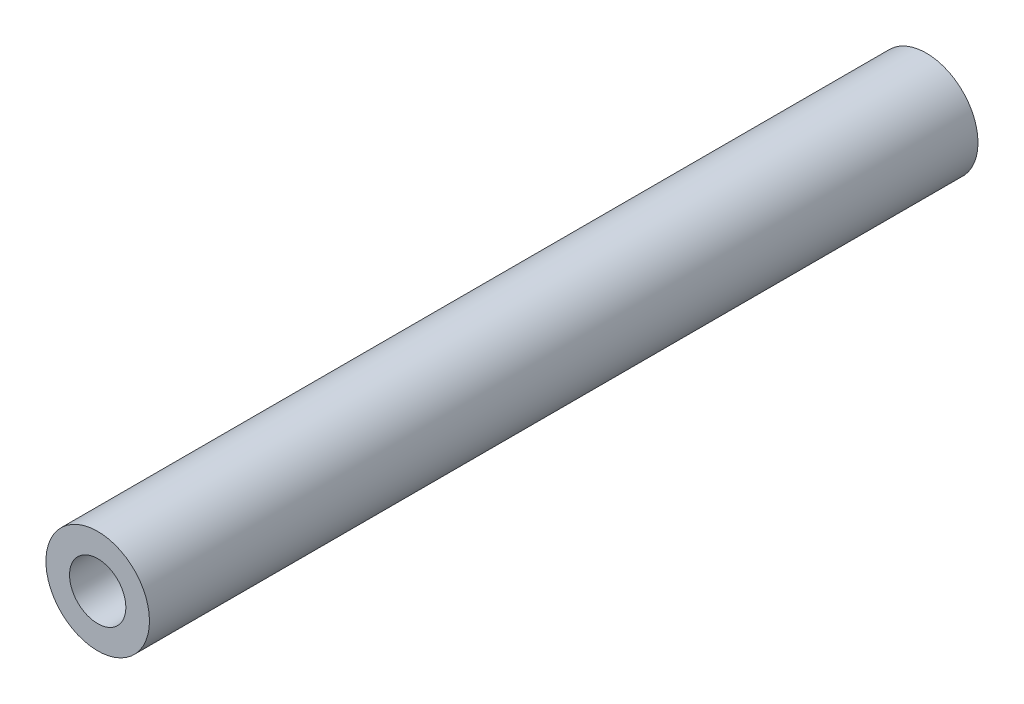
ISO-10303-21;
HEADER;
FILE_DESCRIPTION(('STEP AP214'),'2;1');
FILE_NAME('part.step','',(''),(''),'','','');
FILE_SCHEMA(('AUTOMOTIVE_DESIGN { 1 0 10303 214 1 1 1 1 }'));
ENDSEC;
DATA;
#1=APPLICATION_CONTEXT('core data for automotive mechanical design processes');
#2=APPLICATION_PROTOCOL_DEFINITION('international standard','automotive_design',2000,#1);
#3=PRODUCT_CONTEXT('',#1,'mechanical');
#4=PRODUCT('Part','Part','',(#3));
#5=PRODUCT_RELATED_PRODUCT_CATEGORY('part','',(#4));
#6=PRODUCT_DEFINITION_FORMATION('','',#4);
#7=PRODUCT_DEFINITION_CONTEXT('part definition',#1,'design');
#8=PRODUCT_DEFINITION('design','',#6,#7);
#9=PRODUCT_DEFINITION_SHAPE('','',#8);
#10=(LENGTH_UNIT() NAMED_UNIT(*) SI_UNIT(.MILLI.,.METRE.));
#11=(NAMED_UNIT(*) PLANE_ANGLE_UNIT() SI_UNIT($,.RADIAN.));
#12=(NAMED_UNIT(*) SI_UNIT($,.STERADIAN.) SOLID_ANGLE_UNIT());
#13=UNCERTAINTY_MEASURE_WITH_UNIT(LENGTH_MEASURE(1.E-05),#10,'distance_accuracy_value','');
#14=(GEOMETRIC_REPRESENTATION_CONTEXT(3) GLOBAL_UNCERTAINTY_ASSIGNED_CONTEXT((#13)) GLOBAL_UNIT_ASSIGNED_CONTEXT((#10,
#11,#12)) REPRESENTATION_CONTEXT('',''));
#15=CARTESIAN_POINT('',(0.,0.,0.));
#16=DIRECTION('',(0.,0.,1.));
#17=DIRECTION('',(1.,0.,0.));
#18=AXIS2_PLACEMENT_3D('',#15,#16,#17);
#19=CARTESIAN_POINT('',(0.,0.,25.4));
#20=DIRECTION('',(0.,0.,-1.));
#21=DIRECTION('',(-1.,0.,0.));
#22=AXIS2_PLACEMENT_3D('',#19,#20,#21);
#23=CYLINDRICAL_SURFACE('',#22,3.175);
#24=CARTESIAN_POINT('',(0.,0.,25.4));
#25=DIRECTION('',(0.,0.,1.));
#26=DIRECTION('',(1.,0.,0.));
#27=AXIS2_PLACEMENT_3D('',#24,#25,#26);
#28=CIRCLE('',#27,3.175);
#29=CARTESIAN_POINT('',(3.175,0.,25.4));
#30=VERTEX_POINT('',#29);
#31=EDGE_CURVE('E11',#30,#30,#28,.T.);
#32=ORIENTED_EDGE('',*,*,#31,.F.);
#33=EDGE_LOOP('',(#32));
#34=FACE_BOUND('',#33,.T.);
#35=CARTESIAN_POINT('',(0.,0.,-25.4));
#36=DIRECTION('',(0.,0.,1.));
#37=DIRECTION('',(1.,0.,0.));
#38=AXIS2_PLACEMENT_3D('',#35,#36,#37);
#39=CIRCLE('',#38,3.175);
#40=CARTESIAN_POINT('',(3.175,0.,-25.4));
#41=VERTEX_POINT('',#40);
#42=EDGE_CURVE('E38',#41,#41,#39,.T.);
#43=ORIENTED_EDGE('',*,*,#42,.T.);
#44=EDGE_LOOP('',(#43));
#45=FACE_BOUND('',#44,.T.);
#46=ADVANCED_FACE('F35',(#34,#45),#23,.T.);
#47=CARTESIAN_POINT('',(0.,0.,25.4));
#48=DIRECTION('',(0.,0.,1.));
#49=DIRECTION('',(1.,0.,0.));
#50=AXIS2_PLACEMENT_3D('',#47,#48,#49);
#51=PLANE('',#50);
#52=CARTESIAN_POINT('',(0.,0.,25.4));
#53=DIRECTION('',(0.,0.,1.));
#54=DIRECTION('',(1.,0.,0.));
#55=AXIS2_PLACEMENT_3D('',#52,#53,#54);
#56=CIRCLE('',#55,1.72719999999999);
#57=CARTESIAN_POINT('',(1.72719999999999,0.,25.4));
#58=VERTEX_POINT('',#57);
#59=EDGE_CURVE('E59',#58,#58,#56,.T.);
#60=ORIENTED_EDGE('',*,*,#59,.F.);
#61=EDGE_LOOP('',(#60));
#62=FACE_BOUND('',#61,.T.);
#63=ORIENTED_EDGE('',*,*,#31,.T.);
#64=EDGE_LOOP('',(#63));
#65=FACE_BOUND('',#64,.T.);
#66=ADVANCED_FACE('F77',(#62,#65),#51,.T.);
#67=CARTESIAN_POINT('',(0.,0.,-25.4));
#68=DIRECTION('',(0.,0.,1.));
#69=DIRECTION('',(1.,0.,0.));
#70=AXIS2_PLACEMENT_3D('',#67,#68,#69);
#71=PLANE('',#70);
#72=CARTESIAN_POINT('',(0.,0.,-25.4));
#73=DIRECTION('',(0.,0.,-1.));
#74=DIRECTION('',(-1.,0.,0.));
#75=AXIS2_PLACEMENT_3D('',#72,#73,#74);
#76=CIRCLE('',#75,1.72719999999999);
#77=CARTESIAN_POINT('',(-1.72719999999999,0.,-25.4));
#78=VERTEX_POINT('',#77);
#79=EDGE_CURVE('E58',#78,#78,#76,.T.);
#80=ORIENTED_EDGE('',*,*,#79,.F.);
#81=EDGE_LOOP('',(#80));
#82=FACE_BOUND('',#81,.T.);
#83=ORIENTED_EDGE('',*,*,#42,.F.);
#84=EDGE_LOOP('',(#83));
#85=FACE_BOUND('',#84,.T.);
#86=ADVANCED_FACE('F74',(#82,#85),#71,.F.);
#87=CARTESIAN_POINT('',(0.,0.,-19.05));
#88=DIRECTION('',(0.,0.,-1.));
#89=DIRECTION('',(-1.,0.,0.));
#90=AXIS2_PLACEMENT_3D('',#87,#88,#89);
#91=CONICAL_SURFACE('',#90,1.7272,1.02974425867666);
#92=CARTESIAN_POINT('',(0.,0.,-18.0121935388156));
#93=VERTEX_POINT('',#92);
#94=VERTEX_LOOP('',#93);
#95=FACE_BOUND('',#94,.T.);
#96=CARTESIAN_POINT('',(0.,0.,-19.05));
#97=DIRECTION('',(0.,0.,-1.));
#98=DIRECTION('',(-1.,0.,0.));
#99=AXIS2_PLACEMENT_3D('',#96,#97,#98);
#100=CIRCLE('',#99,1.7272);
#101=CARTESIAN_POINT('',(-1.7272,0.,-19.05));
#102=VERTEX_POINT('',#101);
#103=EDGE_CURVE('E62',#102,#102,#100,.T.);
#104=ORIENTED_EDGE('',*,*,#103,.T.);
#105=EDGE_LOOP('',(#104));
#106=FACE_BOUND('',#105,.T.);
#107=ADVANCED_FACE('F76',(#95,#106),#91,.F.);
#108=CARTESIAN_POINT('',(0.,0.,-25.4));
#109=DIRECTION('',(0.,0.,-1.));
#110=DIRECTION('',(-1.,0.,0.));
#111=AXIS2_PLACEMENT_3D('',#108,#109,#110);
#112=CYLINDRICAL_SURFACE('',#111,1.72719999999999);
#113=ORIENTED_EDGE('',*,*,#103,.F.);
#114=EDGE_LOOP('',(#113));
#115=FACE_BOUND('',#114,.T.);
#116=ORIENTED_EDGE('',*,*,#79,.T.);
#117=EDGE_LOOP('',(#116));
#118=FACE_BOUND('',#117,.T.);
#119=ADVANCED_FACE('F52',(#115,#118),#112,.F.);
#120=CARTESIAN_POINT('',(0.,0.,19.05));
#121=DIRECTION('',(0.,0.,1.));
#122=DIRECTION('',(1.,0.,0.));
#123=AXIS2_PLACEMENT_3D('',#120,#121,#122);
#124=CONICAL_SURFACE('',#123,1.7272,1.02974425867666);
#125=CARTESIAN_POINT('',(0.,0.,18.0121935388156));
#126=VERTEX_POINT('',#125);
#127=VERTEX_LOOP('',#126);
#128=FACE_BOUND('',#127,.T.);
#129=CARTESIAN_POINT('',(0.,0.,19.05));
#130=DIRECTION('',(0.,0.,1.));
#131=DIRECTION('',(1.,0.,0.));
#132=AXIS2_PLACEMENT_3D('',#129,#130,#131);
#133=CIRCLE('',#132,1.7272);
#134=CARTESIAN_POINT('',(1.7272,0.,19.05));
#135=VERTEX_POINT('',#134);
#136=EDGE_CURVE('E56',#135,#135,#133,.T.);
#137=ORIENTED_EDGE('',*,*,#136,.T.);
#138=EDGE_LOOP('',(#137));
#139=FACE_BOUND('',#138,.T.);
#140=ADVANCED_FACE('F48',(#128,#139),#124,.F.);
#141=CARTESIAN_POINT('',(0.,0.,25.4));
#142=DIRECTION('',(0.,0.,1.));
#143=DIRECTION('',(1.,0.,0.));
#144=AXIS2_PLACEMENT_3D('',#141,#142,#143);
#145=CYLINDRICAL_SURFACE('',#144,1.72719999999999);
#146=ORIENTED_EDGE('',*,*,#136,.F.);
#147=EDGE_LOOP('',(#146));
#148=FACE_BOUND('',#147,.T.);
#149=ORIENTED_EDGE('',*,*,#59,.T.);
#150=EDGE_LOOP('',(#149));
#151=FACE_BOUND('',#150,.T.);
#152=ADVANCED_FACE('F51',(#148,#151),#145,.F.);
#153=CLOSED_SHELL('',(#46,#66,#86,#107,#119,#140,#152));
#154=MANIFOLD_SOLID_BREP('B2',#153);
#155=ADVANCED_BREP_SHAPE_REPRESENTATION('',(#18,#154),#14);
#156=SHAPE_DEFINITION_REPRESENTATION(#9,#155);
ENDSEC;
END-ISO-10303-21;
